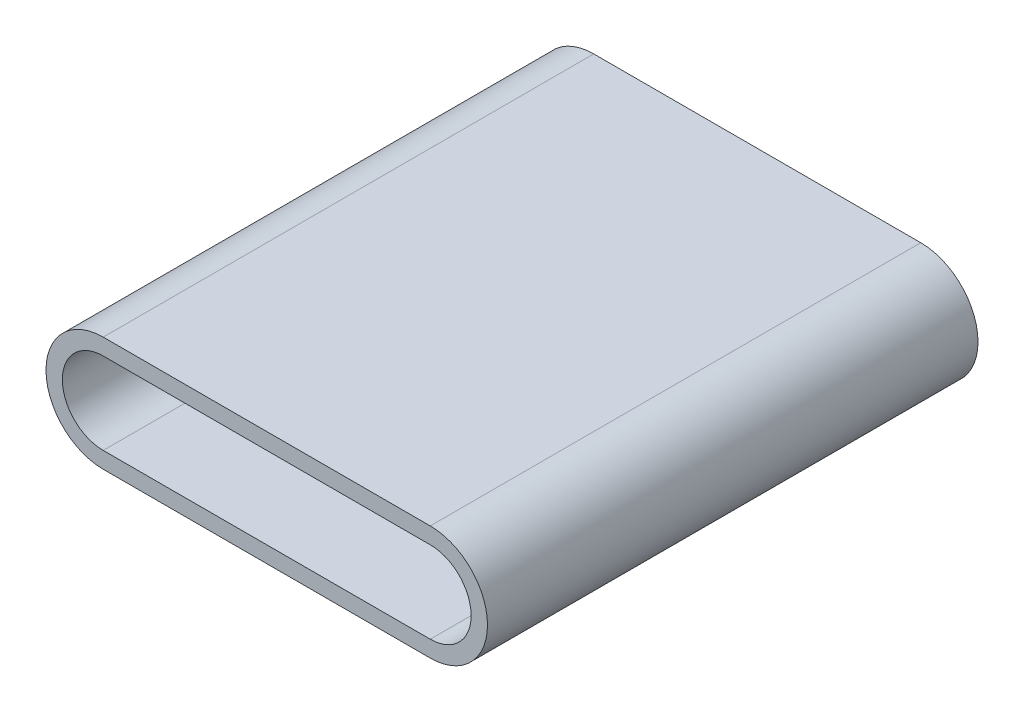
ISO-10303-21;
HEADER;
FILE_DESCRIPTION(('STEP AP214'),'2;1');
FILE_NAME('part.step','',(''),(''),'','','');
FILE_SCHEMA(('AUTOMOTIVE_DESIGN { 1 0 10303 214 1 1 1 1 }'));
ENDSEC;
DATA;
#1=APPLICATION_CONTEXT('core data for automotive mechanical design processes');
#2=APPLICATION_PROTOCOL_DEFINITION('international standard','automotive_design',2000,#1);
#3=PRODUCT_CONTEXT('',#1,'mechanical');
#4=PRODUCT('Part','Part','',(#3));
#5=PRODUCT_RELATED_PRODUCT_CATEGORY('part','',(#4));
#6=PRODUCT_DEFINITION_FORMATION('','',#4);
#7=PRODUCT_DEFINITION_CONTEXT('part definition',#1,'design');
#8=PRODUCT_DEFINITION('design','',#6,#7);
#9=PRODUCT_DEFINITION_SHAPE('','',#8);
#10=(LENGTH_UNIT() NAMED_UNIT(*) SI_UNIT(.MILLI.,.METRE.));
#11=(NAMED_UNIT(*) PLANE_ANGLE_UNIT() SI_UNIT($,.RADIAN.));
#12=(NAMED_UNIT(*) SI_UNIT($,.STERADIAN.) SOLID_ANGLE_UNIT());
#13=UNCERTAINTY_MEASURE_WITH_UNIT(LENGTH_MEASURE(1.E-05),#10,'distance_accuracy_value','');
#14=(GEOMETRIC_REPRESENTATION_CONTEXT(3) GLOBAL_UNCERTAINTY_ASSIGNED_CONTEXT((#13)) GLOBAL_UNIT_ASSIGNED_CONTEXT((#10,
#11,#12)) REPRESENTATION_CONTEXT('',''));
#15=CARTESIAN_POINT('',(0.,0.,0.));
#16=DIRECTION('',(0.,0.,1.));
#17=DIRECTION('',(1.,0.,0.));
#18=AXIS2_PLACEMENT_3D('',#15,#16,#17);
#19=CARTESIAN_POINT('',(-10.,0.,15.));
#20=DIRECTION('',(0.,0.,-1.));
#21=DIRECTION('',(-1.,0.,0.));
#22=AXIS2_PLACEMENT_3D('',#19,#20,#21);
#23=PLANE('',#22);
#24=CARTESIAN_POINT('',(-10.,0.,15.));
#25=DIRECTION('',(0.,0.,1.));
#26=DIRECTION('',(-1.,0.,0.));
#27=AXIS2_PLACEMENT_3D('',#24,#25,#26);
#28=CIRCLE('',#27,3.5);
#29=CARTESIAN_POINT('',(-10.,3.5,15.));
#30=VERTEX_POINT('',#29);
#31=CARTESIAN_POINT('',(-10.,-3.50000000000001,15.));
#32=VERTEX_POINT('',#31);
#33=EDGE_CURVE('E150',#30,#32,#28,.T.);
#34=ORIENTED_EDGE('',*,*,#33,.T.);
#35=DIRECTION('',(1.,0.,0.));
#36=VECTOR('',#35,1.);
#37=CARTESIAN_POINT('',(10.,-3.50000000000001,15.));
#38=LINE('',#37,#36);
#39=CARTESIAN_POINT('',(10.,-3.5,15.));
#40=VERTEX_POINT('',#39);
#41=EDGE_CURVE('E153',#32,#40,#38,.T.);
#42=ORIENTED_EDGE('',*,*,#41,.T.);
#43=CARTESIAN_POINT('',(10.,0.,15.));
#44=DIRECTION('',(0.,0.,1.));
#45=DIRECTION('',(-1.,0.,0.));
#46=AXIS2_PLACEMENT_3D('',#43,#44,#45);
#47=CIRCLE('',#46,3.5);
#48=CARTESIAN_POINT('',(10.,3.5,15.));
#49=VERTEX_POINT('',#48);
#50=EDGE_CURVE('E156',#40,#49,#47,.T.);
#51=ORIENTED_EDGE('',*,*,#50,.T.);
#52=DIRECTION('',(-1.,0.,0.));
#53=VECTOR('',#52,1.);
#54=CARTESIAN_POINT('',(-10.,3.5,15.));
#55=LINE('',#54,#53);
#56=EDGE_CURVE('E158',#49,#30,#55,.T.);
#57=ORIENTED_EDGE('',*,*,#56,.T.);
#58=EDGE_LOOP('',(#34,#42,#51,#57));
#59=FACE_BOUND('',#58,.T.);
#60=CARTESIAN_POINT('',(-10.,0.,15.));
#61=DIRECTION('',(0.,0.,1.));
#62=DIRECTION('',(-1.,0.,0.));
#63=AXIS2_PLACEMENT_3D('',#60,#61,#62);
#64=CIRCLE('',#63,2.5);
#65=CARTESIAN_POINT('',(-10.,2.5,15.));
#66=VERTEX_POINT('',#65);
#67=CARTESIAN_POINT('',(-10.,-2.5,15.));
#68=VERTEX_POINT('',#67);
#69=EDGE_CURVE('E114',#66,#68,#64,.T.);
#70=ORIENTED_EDGE('',*,*,#69,.F.);
#71=DIRECTION('',(-1.,0.,0.));
#72=VECTOR('',#71,1.);
#73=CARTESIAN_POINT('',(-10.,2.5,15.));
#74=LINE('',#73,#72);
#75=CARTESIAN_POINT('',(10.,2.49999999999999,15.));
#76=VERTEX_POINT('',#75);
#77=EDGE_CURVE('E136',#76,#66,#74,.T.);
#78=ORIENTED_EDGE('',*,*,#77,.F.);
#79=CARTESIAN_POINT('',(10.,0.,15.));
#80=DIRECTION('',(0.,0.,1.));
#81=DIRECTION('',(-1.,0.,0.));
#82=AXIS2_PLACEMENT_3D('',#79,#80,#81);
#83=CIRCLE('',#82,2.5);
#84=CARTESIAN_POINT('',(10.,-2.5,15.));
#85=VERTEX_POINT('',#84);
#86=EDGE_CURVE('E134',#85,#76,#83,.T.);
#87=ORIENTED_EDGE('',*,*,#86,.F.);
#88=DIRECTION('',(1.,0.,0.));
#89=VECTOR('',#88,1.);
#90=CARTESIAN_POINT('',(10.,-2.5,15.));
#91=LINE('',#90,#89);
#92=EDGE_CURVE('E122',#68,#85,#91,.T.);
#93=ORIENTED_EDGE('',*,*,#92,.F.);
#94=EDGE_LOOP('',(#70,#78,#87,#93));
#95=FACE_BOUND('',#94,.T.);
#96=ADVANCED_FACE('F49',(#59,#95),#23,.F.);
#97=CARTESIAN_POINT('',(-10.,0.,-15.));
#98=DIRECTION('',(0.,0.,-1.));
#99=DIRECTION('',(-1.,0.,0.));
#100=AXIS2_PLACEMENT_3D('',#97,#98,#99);
#101=PLANE('',#100);
#102=CARTESIAN_POINT('',(-10.,0.,-15.));
#103=DIRECTION('',(0.,0.,1.));
#104=DIRECTION('',(-1.,0.,0.));
#105=AXIS2_PLACEMENT_3D('',#102,#103,#104);
#106=CIRCLE('',#105,3.5);
#107=CARTESIAN_POINT('',(-10.,3.5,-15.));
#108=VERTEX_POINT('',#107);
#109=CARTESIAN_POINT('',(-10.,-3.50000000000001,-15.));
#110=VERTEX_POINT('',#109);
#111=EDGE_CURVE('E130',#108,#110,#106,.T.);
#112=ORIENTED_EDGE('',*,*,#111,.F.);
#113=DIRECTION('',(-1.,0.,0.));
#114=VECTOR('',#113,1.);
#115=CARTESIAN_POINT('',(-10.,3.5,-15.));
#116=LINE('',#115,#114);
#117=CARTESIAN_POINT('',(10.,3.5,-15.));
#118=VERTEX_POINT('',#117);
#119=EDGE_CURVE('E154',#118,#108,#116,.T.);
#120=ORIENTED_EDGE('',*,*,#119,.F.);
#121=CARTESIAN_POINT('',(10.,0.,-15.));
#122=DIRECTION('',(0.,0.,1.));
#123=DIRECTION('',(-1.,0.,0.));
#124=AXIS2_PLACEMENT_3D('',#121,#122,#123);
#125=CIRCLE('',#124,3.5);
#126=CARTESIAN_POINT('',(10.,-3.5,-15.));
#127=VERTEX_POINT('',#126);
#128=EDGE_CURVE('E165',#127,#118,#125,.T.);
#129=ORIENTED_EDGE('',*,*,#128,.F.);
#130=DIRECTION('',(1.,0.,0.));
#131=VECTOR('',#130,1.);
#132=CARTESIAN_POINT('',(10.,-3.50000000000001,-15.));
#133=LINE('',#132,#131);
#134=EDGE_CURVE('E163',#110,#127,#133,.T.);
#135=ORIENTED_EDGE('',*,*,#134,.F.);
#136=EDGE_LOOP('',(#112,#120,#129,#135));
#137=FACE_BOUND('',#136,.T.);
#138=DIRECTION('',(-1.,0.,0.));
#139=VECTOR('',#138,1.);
#140=CARTESIAN_POINT('',(-10.,2.5,-15.));
#141=LINE('',#140,#139);
#142=CARTESIAN_POINT('',(10.,2.49999999999999,-15.));
#143=VERTEX_POINT('',#142);
#144=CARTESIAN_POINT('',(-10.,2.5,-15.));
#145=VERTEX_POINT('',#144);
#146=EDGE_CURVE('E123',#143,#145,#141,.T.);
#147=ORIENTED_EDGE('',*,*,#146,.T.);
#148=CARTESIAN_POINT('',(-10.,0.,-15.));
#149=DIRECTION('',(0.,0.,1.));
#150=DIRECTION('',(-1.,0.,0.));
#151=AXIS2_PLACEMENT_3D('',#148,#149,#150);
#152=CIRCLE('',#151,2.5);
#153=CARTESIAN_POINT('',(-10.,-2.5,-15.));
#154=VERTEX_POINT('',#153);
#155=EDGE_CURVE('E72',#145,#154,#152,.T.);
#156=ORIENTED_EDGE('',*,*,#155,.T.);
#157=DIRECTION('',(1.,0.,0.));
#158=VECTOR('',#157,1.);
#159=CARTESIAN_POINT('',(10.,-2.5,-15.));
#160=LINE('',#159,#158);
#161=CARTESIAN_POINT('',(10.,-2.5,-15.));
#162=VERTEX_POINT('',#161);
#163=EDGE_CURVE('E129',#154,#162,#160,.T.);
#164=ORIENTED_EDGE('',*,*,#163,.T.);
#165=CARTESIAN_POINT('',(10.,0.,-15.));
#166=DIRECTION('',(0.,0.,1.));
#167=DIRECTION('',(-1.,0.,0.));
#168=AXIS2_PLACEMENT_3D('',#165,#166,#167);
#169=CIRCLE('',#168,2.5);
#170=EDGE_CURVE('E142',#162,#143,#169,.T.);
#171=ORIENTED_EDGE('',*,*,#170,.T.);
#172=EDGE_LOOP('',(#147,#156,#164,#171));
#173=FACE_BOUND('',#172,.T.);
#174=ADVANCED_FACE('F183',(#137,#173),#101,.T.);
#175=CARTESIAN_POINT('',(-10.,0.,15.));
#176=DIRECTION('',(0.,0.,-1.));
#177=DIRECTION('',(-1.,0.,0.));
#178=AXIS2_PLACEMENT_3D('',#175,#176,#177);
#179=CYLINDRICAL_SURFACE('',#178,3.5);
#180=ORIENTED_EDGE('',*,*,#111,.T.);
#181=DIRECTION('',(0.,0.,-1.));
#182=VECTOR('',#181,1.);
#183=CARTESIAN_POINT('',(-10.,-3.50000000000001,15.));
#184=LINE('',#183,#182);
#185=EDGE_CURVE('E13',#32,#110,#184,.T.);
#186=ORIENTED_EDGE('',*,*,#185,.F.);
#187=ORIENTED_EDGE('',*,*,#33,.F.);
#188=DIRECTION('',(0.,0.,-1.));
#189=VECTOR('',#188,1.);
#190=CARTESIAN_POINT('',(-10.,3.5,15.));
#191=LINE('',#190,#189);
#192=EDGE_CURVE('E160',#30,#108,#191,.T.);
#193=ORIENTED_EDGE('',*,*,#192,.T.);
#194=EDGE_LOOP('',(#180,#186,#187,#193));
#195=FACE_BOUND('',#194,.T.);
#196=ADVANCED_FACE('F51',(#195),#179,.T.);
#197=CARTESIAN_POINT('',(10.,-3.50000000000001,15.));
#198=DIRECTION('',(0.,1.,0.));
#199=DIRECTION('',(0.,0.,1.));
#200=AXIS2_PLACEMENT_3D('',#197,#198,#199);
#201=PLANE('',#200);
#202=ORIENTED_EDGE('',*,*,#134,.T.);
#203=DIRECTION('',(0.,0.,-1.));
#204=VECTOR('',#203,1.);
#205=CARTESIAN_POINT('',(10.,-3.5,15.));
#206=LINE('',#205,#204);
#207=EDGE_CURVE('E57',#40,#127,#206,.T.);
#208=ORIENTED_EDGE('',*,*,#207,.F.);
#209=ORIENTED_EDGE('',*,*,#41,.F.);
#210=ORIENTED_EDGE('',*,*,#185,.T.);
#211=EDGE_LOOP('',(#202,#208,#209,#210));
#212=FACE_BOUND('',#211,.T.);
#213=ADVANCED_FACE('F193',(#212),#201,.F.);
#214=CARTESIAN_POINT('',(10.,0.,15.));
#215=DIRECTION('',(0.,0.,-1.));
#216=DIRECTION('',(-1.,0.,0.));
#217=AXIS2_PLACEMENT_3D('',#214,#215,#216);
#218=CYLINDRICAL_SURFACE('',#217,3.5);
#219=ORIENTED_EDGE('',*,*,#128,.T.);
#220=DIRECTION('',(0.,0.,-1.));
#221=VECTOR('',#220,1.);
#222=CARTESIAN_POINT('',(10.,3.5,15.));
#223=LINE('',#222,#221);
#224=EDGE_CURVE('E170',#49,#118,#223,.T.);
#225=ORIENTED_EDGE('',*,*,#224,.F.);
#226=ORIENTED_EDGE('',*,*,#50,.F.);
#227=ORIENTED_EDGE('',*,*,#207,.T.);
#228=EDGE_LOOP('',(#219,#225,#226,#227));
#229=FACE_BOUND('',#228,.T.);
#230=ADVANCED_FACE('F177',(#229),#218,.T.);
#231=CARTESIAN_POINT('',(-10.,3.5,15.));
#232=DIRECTION('',(0.,-1.,0.));
#233=DIRECTION('',(1.,0.,0.));
#234=AXIS2_PLACEMENT_3D('',#231,#232,#233);
#235=PLANE('',#234);
#236=ORIENTED_EDGE('',*,*,#119,.T.);
#237=ORIENTED_EDGE('',*,*,#192,.F.);
#238=ORIENTED_EDGE('',*,*,#56,.F.);
#239=ORIENTED_EDGE('',*,*,#224,.T.);
#240=EDGE_LOOP('',(#236,#237,#238,#239));
#241=FACE_BOUND('',#240,.T.);
#242=ADVANCED_FACE('F187',(#241),#235,.F.);
#243=CARTESIAN_POINT('',(-10.,0.,15.));
#244=DIRECTION('',(0.,0.,-1.));
#245=DIRECTION('',(-1.,0.,0.));
#246=AXIS2_PLACEMENT_3D('',#243,#244,#245);
#247=CYLINDRICAL_SURFACE('',#246,2.5);
#248=ORIENTED_EDGE('',*,*,#155,.F.);
#249=DIRECTION('',(0.,0.,-1.));
#250=VECTOR('',#249,1.);
#251=CARTESIAN_POINT('',(-10.,2.5,15.));
#252=LINE('',#251,#250);
#253=EDGE_CURVE('E118',#66,#145,#252,.T.);
#254=ORIENTED_EDGE('',*,*,#253,.F.);
#255=ORIENTED_EDGE('',*,*,#69,.T.);
#256=DIRECTION('',(0.,0.,-1.));
#257=VECTOR('',#256,1.);
#258=CARTESIAN_POINT('',(-10.,-2.5,15.));
#259=LINE('',#258,#257);
#260=EDGE_CURVE('E117',#68,#154,#259,.T.);
#261=ORIENTED_EDGE('',*,*,#260,.T.);
#262=EDGE_LOOP('',(#248,#254,#255,#261));
#263=FACE_BOUND('',#262,.T.);
#264=ADVANCED_FACE('F116',(#263),#247,.F.);
#265=CARTESIAN_POINT('',(10.,-2.5,15.));
#266=DIRECTION('',(0.,1.,0.));
#267=DIRECTION('',(-1.,0.,0.));
#268=AXIS2_PLACEMENT_3D('',#265,#266,#267);
#269=PLANE('',#268);
#270=ORIENTED_EDGE('',*,*,#163,.F.);
#271=ORIENTED_EDGE('',*,*,#260,.F.);
#272=ORIENTED_EDGE('',*,*,#92,.T.);
#273=DIRECTION('',(0.,0.,-1.));
#274=VECTOR('',#273,1.);
#275=CARTESIAN_POINT('',(10.,-2.5,15.));
#276=LINE('',#275,#274);
#277=EDGE_CURVE('E131',#85,#162,#276,.T.);
#278=ORIENTED_EDGE('',*,*,#277,.T.);
#279=EDGE_LOOP('',(#270,#271,#272,#278));
#280=FACE_BOUND('',#279,.T.);
#281=ADVANCED_FACE('F126',(#280),#269,.T.);
#282=CARTESIAN_POINT('',(10.,0.,15.));
#283=DIRECTION('',(0.,0.,-1.));
#284=DIRECTION('',(-1.,0.,0.));
#285=AXIS2_PLACEMENT_3D('',#282,#283,#284);
#286=CYLINDRICAL_SURFACE('',#285,2.5);
#287=ORIENTED_EDGE('',*,*,#170,.F.);
#288=ORIENTED_EDGE('',*,*,#277,.F.);
#289=ORIENTED_EDGE('',*,*,#86,.T.);
#290=DIRECTION('',(0.,0.,-1.));
#291=VECTOR('',#290,1.);
#292=CARTESIAN_POINT('',(10.,2.49999999999999,15.));
#293=LINE('',#292,#291);
#294=EDGE_CURVE('E64',#76,#143,#293,.T.);
#295=ORIENTED_EDGE('',*,*,#294,.T.);
#296=EDGE_LOOP('',(#287,#288,#289,#295));
#297=FACE_BOUND('',#296,.T.);
#298=ADVANCED_FACE('F216',(#297),#286,.F.);
#299=CARTESIAN_POINT('',(-10.,2.5,15.));
#300=DIRECTION('',(0.,-1.,0.));
#301=DIRECTION('',(1.,0.,0.));
#302=AXIS2_PLACEMENT_3D('',#299,#300,#301);
#303=PLANE('',#302);
#304=ORIENTED_EDGE('',*,*,#146,.F.);
#305=ORIENTED_EDGE('',*,*,#294,.F.);
#306=ORIENTED_EDGE('',*,*,#77,.T.);
#307=ORIENTED_EDGE('',*,*,#253,.T.);
#308=EDGE_LOOP('',(#304,#305,#306,#307));
#309=FACE_BOUND('',#308,.T.);
#310=ADVANCED_FACE('F220',(#309),#303,.T.);
#311=CLOSED_SHELL('',(#96,#174,#196,#213,#230,#242,#264,#281,#298,#310));
#312=MANIFOLD_SOLID_BREP('B2',#311);
#313=ADVANCED_BREP_SHAPE_REPRESENTATION('',(#18,#312),#14);
#314=SHAPE_DEFINITION_REPRESENTATION(#9,#313);
ENDSEC;
END-ISO-10303-21;
